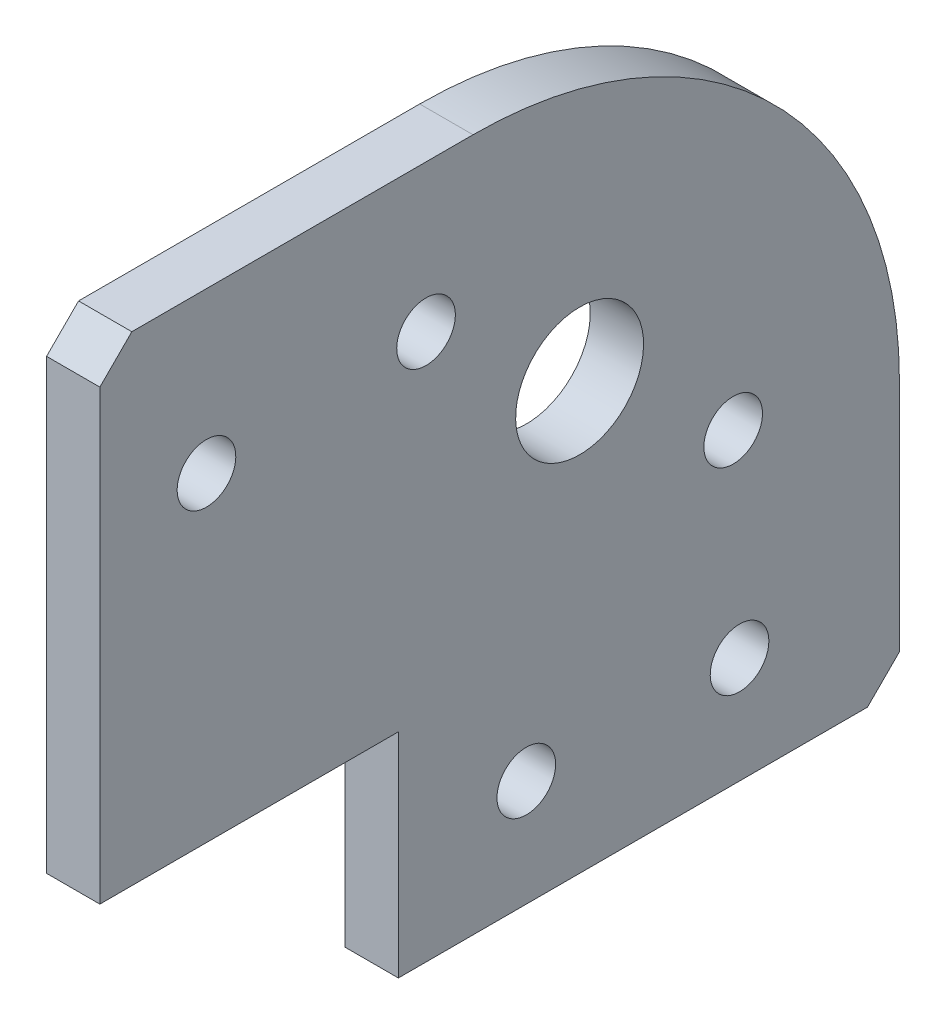
ISO-10303-21;
HEADER;
FILE_DESCRIPTION(('STEP AP214'),'2;1');
FILE_NAME('part.step','',(''),(''),'','','');
FILE_SCHEMA(('AUTOMOTIVE_DESIGN { 1 0 10303 214 1 1 1 1 }'));
ENDSEC;
DATA;
#1=APPLICATION_CONTEXT('core data for automotive mechanical design processes');
#2=APPLICATION_PROTOCOL_DEFINITION('international standard','automotive_design',2000,#1);
#3=PRODUCT_CONTEXT('',#1,'mechanical');
#4=PRODUCT('Part','Part','',(#3));
#5=PRODUCT_RELATED_PRODUCT_CATEGORY('part','',(#4));
#6=PRODUCT_DEFINITION_FORMATION('','',#4);
#7=PRODUCT_DEFINITION_CONTEXT('part definition',#1,'design');
#8=PRODUCT_DEFINITION('design','',#6,#7);
#9=PRODUCT_DEFINITION_SHAPE('','',#8);
#10=(LENGTH_UNIT() NAMED_UNIT(*) SI_UNIT(.MILLI.,.METRE.));
#11=(NAMED_UNIT(*) PLANE_ANGLE_UNIT() SI_UNIT($,.RADIAN.));
#12=(NAMED_UNIT(*) SI_UNIT($,.STERADIAN.) SOLID_ANGLE_UNIT());
#13=UNCERTAINTY_MEASURE_WITH_UNIT(LENGTH_MEASURE(1.E-05),#10,'distance_accuracy_value','');
#14=(GEOMETRIC_REPRESENTATION_CONTEXT(3) GLOBAL_UNCERTAINTY_ASSIGNED_CONTEXT((#13)) GLOBAL_UNIT_ASSIGNED_CONTEXT((#10,
#11,#12)) REPRESENTATION_CONTEXT('',''));
#15=CARTESIAN_POINT('',(0.,0.,0.));
#16=DIRECTION('',(0.,0.,1.));
#17=DIRECTION('',(1.,0.,0.));
#18=AXIS2_PLACEMENT_3D('',#15,#16,#17);
#19=CARTESIAN_POINT('',(605.828774838871,24.9999999999957,-39.9999999999997));
#20=DIRECTION('',(0.,0.,-1.));
#21=DIRECTION('',(0.,1.,0.));
#22=AXIS2_PLACEMENT_3D('',#19,#20,#21);
#23=PLANE('',#22);
#24=DIRECTION('',(0.,-1.,0.));
#25=VECTOR('',#24,1.);
#26=CARTESIAN_POINT('',(600.828774838871,24.9999999999957,-39.9999999999997));
#27=LINE('',#26,#25);
#28=CARTESIAN_POINT('',(600.828774838871,-15.0000000000043,-39.9999999999996));
#29=VERTEX_POINT('',#28);
#30=CARTESIAN_POINT('',(600.828774838871,-37.0000000000043,-39.9999999999996));
#31=VERTEX_POINT('',#30);
#32=EDGE_CURVE('E168',#29,#31,#27,.T.);
#33=ORIENTED_EDGE('',*,*,#32,.F.);
#34=DIRECTION('',(-1.,0.,0.));
#35=VECTOR('',#34,1.);
#36=CARTESIAN_POINT('',(605.828774838871,-15.0000000000044,-39.9999999999996));
#37=LINE('',#36,#35);
#38=CARTESIAN_POINT('',(605.828774838871,-15.0000000000044,-39.9999999999996));
#39=VERTEX_POINT('',#38);
#40=EDGE_CURVE('E43',#29,#39,#37,.F.);
#41=ORIENTED_EDGE('',*,*,#40,.T.);
#42=DIRECTION('',(0.,-1.,0.));
#43=VECTOR('',#42,1.);
#44=CARTESIAN_POINT('',(605.828774838871,24.9999999999957,-39.9999999999997));
#45=LINE('',#44,#43);
#46=CARTESIAN_POINT('',(605.828774838871,-37.0000000000043,-39.9999999999996));
#47=VERTEX_POINT('',#46);
#48=EDGE_CURVE('E171',#39,#47,#45,.T.);
#49=ORIENTED_EDGE('',*,*,#48,.T.);
#50=DIRECTION('',(-1.,0.,0.));
#51=VECTOR('',#50,1.);
#52=CARTESIAN_POINT('',(605.828774838871,-37.0000000000043,-39.9999999999996));
#53=LINE('',#52,#51);
#54=EDGE_CURVE('E182',#47,#31,#53,.T.);
#55=ORIENTED_EDGE('',*,*,#54,.T.);
#56=EDGE_LOOP('',(#33,#41,#49,#55));
#57=FACE_BOUND('',#56,.T.);
#58=ADVANCED_FACE('F35',(#57),#23,.T.);
#59=CARTESIAN_POINT('',(605.828774838871,24.9999999999957,35.0000000000004));
#60=DIRECTION('',(0.,1.,0.));
#61=DIRECTION('',(-1.,0.,0.));
#62=AXIS2_PLACEMENT_3D('',#59,#60,#61);
#63=PLANE('',#62);
#64=DIRECTION('',(0.,0.,-1.));
#65=VECTOR('',#64,1.);
#66=CARTESIAN_POINT('',(605.828774838871,24.9999999999957,35.0000000000004));
#67=LINE('',#66,#65);
#68=CARTESIAN_POINT('',(605.828774838871,24.9999999999957,32.0000000000003));
#69=VERTEX_POINT('',#68);
#70=CARTESIAN_POINT('',(605.828774838871,24.9999999999957,3.7470027081099E-13));
#71=VERTEX_POINT('',#70);
#72=EDGE_CURVE('E179',#69,#71,#67,.T.);
#73=ORIENTED_EDGE('',*,*,#72,.T.);
#74=DIRECTION('',(-1.,0.,0.));
#75=VECTOR('',#74,1.);
#76=CARTESIAN_POINT('',(605.828774838871,24.9999999999957,3.81639164714898E-13));
#77=LINE('',#76,#75);
#78=CARTESIAN_POINT('',(600.828774838871,24.9999999999957,3.7470027081099E-13));
#79=VERTEX_POINT('',#78);
#80=EDGE_CURVE('E207',#71,#79,#77,.T.);
#81=ORIENTED_EDGE('',*,*,#80,.T.);
#82=DIRECTION('',(0.,0.,-1.));
#83=VECTOR('',#82,1.);
#84=CARTESIAN_POINT('',(600.828774838871,24.9999999999957,35.0000000000004));
#85=LINE('',#84,#83);
#86=CARTESIAN_POINT('',(600.828774838871,24.9999999999957,32.0000000000003));
#87=VERTEX_POINT('',#86);
#88=EDGE_CURVE('E174',#87,#79,#85,.T.);
#89=ORIENTED_EDGE('',*,*,#88,.F.);
#90=DIRECTION('',(1.,0.,0.));
#91=VECTOR('',#90,1.);
#92=CARTESIAN_POINT('',(605.828774838871,24.9999999999957,32.0000000000003));
#93=LINE('',#92,#91);
#94=EDGE_CURVE('E205',#87,#69,#93,.T.);
#95=ORIENTED_EDGE('',*,*,#94,.T.);
#96=EDGE_LOOP('',(#73,#81,#89,#95));
#97=FACE_BOUND('',#96,.T.);
#98=ADVANCED_FACE('F213',(#97),#63,.T.);
#99=CARTESIAN_POINT('',(605.828774838871,-40.0000000000043,35.0000000000004));
#100=DIRECTION('',(0.,0.,1.));
#101=DIRECTION('',(1.,0.,0.));
#102=AXIS2_PLACEMENT_3D('',#99,#100,#101);
#103=PLANE('',#102);
#104=DIRECTION('',(-1.,0.,0.));
#105=VECTOR('',#104,1.);
#106=CARTESIAN_POINT('',(605.829774838871,-20.0000000000043,35.0000000000004));
#107=LINE('',#106,#105);
#108=CARTESIAN_POINT('',(605.828774838871,-20.0000000000043,35.0000000000004));
#109=VERTEX_POINT('',#108);
#110=CARTESIAN_POINT('',(600.828774838871,-20.0000000000043,35.0000000000004));
#111=VERTEX_POINT('',#110);
#112=EDGE_CURVE('E114',#109,#111,#107,.T.);
#113=ORIENTED_EDGE('',*,*,#112,.F.);
#114=DIRECTION('',(0.,1.,0.));
#115=VECTOR('',#114,1.);
#116=CARTESIAN_POINT('',(605.828774838871,-40.0000000000043,35.0000000000004));
#117=LINE('',#116,#115);
#118=CARTESIAN_POINT('',(605.828774838871,21.9999999999957,35.0000000000004));
#119=VERTEX_POINT('',#118);
#120=EDGE_CURVE('E177',#109,#119,#117,.T.);
#121=ORIENTED_EDGE('',*,*,#120,.T.);
#122=DIRECTION('',(-1.,0.,0.));
#123=VECTOR('',#122,1.);
#124=CARTESIAN_POINT('',(605.828774838871,21.9999999999957,35.0000000000004));
#125=LINE('',#124,#123);
#126=CARTESIAN_POINT('',(600.828774838871,21.9999999999957,35.0000000000004));
#127=VERTEX_POINT('',#126);
#128=EDGE_CURVE('E202',#119,#127,#125,.T.);
#129=ORIENTED_EDGE('',*,*,#128,.T.);
#130=DIRECTION('',(0.,1.,0.));
#131=VECTOR('',#130,1.);
#132=CARTESIAN_POINT('',(600.828774838871,-40.0000000000043,35.0000000000004));
#133=LINE('',#132,#131);
#134=EDGE_CURVE('E185',#111,#127,#133,.T.);
#135=ORIENTED_EDGE('',*,*,#134,.F.);
#136=EDGE_LOOP('',(#113,#121,#129,#135));
#137=FACE_BOUND('',#136,.T.);
#138=ADVANCED_FACE('F224',(#137),#103,.T.);
#139=CARTESIAN_POINT('',(605.828774838871,-40.0000000000043,-39.9999999999996));
#140=DIRECTION('',(0.,-1.,0.));
#141=DIRECTION('',(1.,0.,0.));
#142=AXIS2_PLACEMENT_3D('',#139,#140,#141);
#143=PLANE('',#142);
#144=DIRECTION('',(-1.,0.,0.));
#145=VECTOR('',#144,1.);
#146=CARTESIAN_POINT('',(605.829774838871,-40.0000000000043,7.00000000000037));
#147=LINE('',#146,#145);
#148=CARTESIAN_POINT('',(605.828774838871,-40.0000000000043,7.00000000000037));
#149=VERTEX_POINT('',#148);
#150=CARTESIAN_POINT('',(600.828774838871,-40.0000000000043,7.00000000000037));
#151=VERTEX_POINT('',#150);
#152=EDGE_CURVE('E113',#149,#151,#147,.T.);
#153=ORIENTED_EDGE('',*,*,#152,.T.);
#154=DIRECTION('',(0.,0.,1.));
#155=VECTOR('',#154,1.);
#156=CARTESIAN_POINT('',(600.828774838871,-40.0000000000043,-39.9999999999996));
#157=LINE('',#156,#155);
#158=CARTESIAN_POINT('',(600.828774838871,-40.0000000000043,-36.9999999999996));
#159=VERTEX_POINT('',#158);
#160=EDGE_CURVE('E126',#159,#151,#157,.T.);
#161=ORIENTED_EDGE('',*,*,#160,.F.);
#162=DIRECTION('',(1.,0.,0.));
#163=VECTOR('',#162,1.);
#164=CARTESIAN_POINT('',(605.828774838871,-40.0000000000043,-36.9999999999996));
#165=LINE('',#164,#163);
#166=CARTESIAN_POINT('',(605.828774838871,-40.0000000000043,-36.9999999999996));
#167=VERTEX_POINT('',#166);
#168=EDGE_CURVE('E194',#159,#167,#165,.T.);
#169=ORIENTED_EDGE('',*,*,#168,.T.);
#170=DIRECTION('',(0.,0.,1.));
#171=VECTOR('',#170,1.);
#172=CARTESIAN_POINT('',(605.828774838871,-40.0000000000043,-39.9999999999996));
#173=LINE('',#172,#171);
#174=EDGE_CURVE('E173',#167,#149,#173,.T.);
#175=ORIENTED_EDGE('',*,*,#174,.T.);
#176=EDGE_LOOP('',(#153,#161,#169,#175));
#177=FACE_BOUND('',#176,.T.);
#178=ADVANCED_FACE('F241',(#177),#143,.T.);
#179=CARTESIAN_POINT('',(605.828774838871,-4.14047445791686E-12,8.9329103349744E-13));
#180=DIRECTION('',(-1.,0.,0.));
#181=DIRECTION('',(0.,-1.,0.));
#182=AXIS2_PLACEMENT_3D('',#179,#180,#181);
#183=PLANE('',#182);
#184=CARTESIAN_POINT('',(605.828774838871,11.204416196643,4.40567796711833));
#185=DIRECTION('',(-1.,0.,0.));
#186=DIRECTION('',(0.,-1.,0.));
#187=AXIS2_PLACEMENT_3D('',#184,#185,#186);
#188=CIRCLE('',#187,2.74999999999882);
#189=CARTESIAN_POINT('',(605.828774838871,8.45441619664418,4.40567796711833));
#190=VERTEX_POINT('',#189);
#191=EDGE_CURVE('E138',#190,#190,#188,.F.);
#192=ORIENTED_EDGE('',*,*,#191,.F.);
#193=EDGE_LOOP('',(#192));
#194=FACE_BOUND('',#193,.T.);
#195=CARTESIAN_POINT('',(605.828774838871,-11.2044161966516,-24.4056779671176));
#196=DIRECTION('',(-1.,0.,0.));
#197=DIRECTION('',(0.,-1.,0.));
#198=AXIS2_PLACEMENT_3D('',#195,#196,#197);
#199=CIRCLE('',#198,2.74999999999882);
#200=CARTESIAN_POINT('',(605.828774838871,-13.9544161966504,-24.4056779671176));
#201=VERTEX_POINT('',#200);
#202=EDGE_CURVE('E139',#201,#201,#199,.F.);
#203=ORIENTED_EDGE('',*,*,#202,.F.);
#204=EDGE_LOOP('',(#203));
#205=FACE_BOUND('',#204,.T.);
#206=CARTESIAN_POINT('',(605.828774838871,-4.29963245912592E-12,-9.99999999999962));
#207=DIRECTION('',(-1.,0.,0.));
#208=DIRECTION('',(0.,1.,0.));
#209=AXIS2_PLACEMENT_3D('',#206,#207,#208);
#210=CIRCLE('',#209,6.);
#211=CARTESIAN_POINT('',(605.828774838871,5.9999999999957,-9.99999999999962));
#212=VERTEX_POINT('',#211);
#213=EDGE_CURVE('E147',#212,#212,#210,.T.);
#214=ORIENTED_EDGE('',*,*,#213,.T.);
#215=EDGE_LOOP('',(#214));
#216=FACE_BOUND('',#215,.T.);
#217=CARTESIAN_POINT('',(605.828774838871,-30.0000000000043,-24.9999999999996));
#218=DIRECTION('',(-1.,0.,0.));
#219=DIRECTION('',(0.,1.,0.));
#220=AXIS2_PLACEMENT_3D('',#217,#218,#219);
#221=CIRCLE('',#220,2.75000000000001);
#222=CARTESIAN_POINT('',(605.828774838871,-27.2500000000043,-24.9999999999996));
#223=VERTEX_POINT('',#222);
#224=EDGE_CURVE('E153',#223,#223,#221,.T.);
#225=ORIENTED_EDGE('',*,*,#224,.T.);
#226=EDGE_LOOP('',(#225));
#227=FACE_BOUND('',#226,.T.);
#228=CARTESIAN_POINT('',(605.828774838871,9.9999999999957,25.0000000000004));
#229=DIRECTION('',(-1.,0.,0.));
#230=DIRECTION('',(0.,1.,0.));
#231=AXIS2_PLACEMENT_3D('',#228,#229,#230);
#232=CIRCLE('',#231,2.75);
#233=CARTESIAN_POINT('',(605.828774838871,12.7499999999957,25.0000000000004));
#234=VERTEX_POINT('',#233);
#235=EDGE_CURVE('E159',#234,#234,#232,.T.);
#236=ORIENTED_EDGE('',*,*,#235,.T.);
#237=EDGE_LOOP('',(#236));
#238=FACE_BOUND('',#237,.T.);
#239=CARTESIAN_POINT('',(605.828774838871,-30.0000000000043,-4.99999999999962));
#240=DIRECTION('',(-1.,0.,0.));
#241=DIRECTION('',(0.,-1.,0.));
#242=AXIS2_PLACEMENT_3D('',#239,#240,#241);
#243=CIRCLE('',#242,2.75);
#244=CARTESIAN_POINT('',(605.828774838871,-32.7500000000043,-4.99999999999962));
#245=VERTEX_POINT('',#244);
#246=EDGE_CURVE('E165',#245,#245,#243,.T.);
#247=ORIENTED_EDGE('',*,*,#246,.T.);
#248=EDGE_LOOP('',(#247));
#249=FACE_BOUND('',#248,.T.);
#250=ORIENTED_EDGE('',*,*,#48,.F.);
#251=CARTESIAN_POINT('',(605.828774838871,-15.0000000000043,3.88578058618805E-13));
#252=DIRECTION('',(-1.,0.,0.));
#253=DIRECTION('',(0.,-1.,0.));
#254=AXIS2_PLACEMENT_3D('',#251,#252,#253);
#255=CIRCLE('',#254,40.);
#256=EDGE_CURVE('E11',#39,#71,#255,.F.);
#257=ORIENTED_EDGE('',*,*,#256,.T.);
#258=ORIENTED_EDGE('',*,*,#72,.F.);
#259=DIRECTION('',(0.,0.707106781186545,-0.70710678118655));
#260=VECTOR('',#259,1.);
#261=CARTESIAN_POINT('',(605.828774838871,21.9999999999957,35.0000000000004));
#262=LINE('',#261,#260);
#263=EDGE_CURVE('E196',#69,#119,#262,.F.);
#264=ORIENTED_EDGE('',*,*,#263,.T.);
#265=ORIENTED_EDGE('',*,*,#120,.F.);
#266=DIRECTION('',(0.,0.,1.));
#267=VECTOR('',#266,1.);
#268=CARTESIAN_POINT('',(605.828774838871,-20.0000000000043,35.0000000000004));
#269=LINE('',#268,#267);
#270=CARTESIAN_POINT('',(605.828774838871,-20.0000000000043,7.00000000000037));
#271=VERTEX_POINT('',#270);
#272=EDGE_CURVE('E131',#271,#109,#269,.T.);
#273=ORIENTED_EDGE('',*,*,#272,.F.);
#274=DIRECTION('',(0.,1.,0.));
#275=VECTOR('',#274,1.);
#276=CARTESIAN_POINT('',(605.828774838871,-20.0000000000043,7.00000000000037));
#277=LINE('',#276,#275);
#278=EDGE_CURVE('E110',#149,#271,#277,.T.);
#279=ORIENTED_EDGE('',*,*,#278,.F.);
#280=ORIENTED_EDGE('',*,*,#174,.F.);
#281=DIRECTION('',(0.,-0.707106781186543,0.707106781186552));
#282=VECTOR('',#281,1.);
#283=CARTESIAN_POINT('',(605.828774838871,-37.0000000000043,-39.9999999999996));
#284=LINE('',#283,#282);
#285=EDGE_CURVE('E199',#167,#47,#284,.F.);
#286=ORIENTED_EDGE('',*,*,#285,.T.);
#287=EDGE_LOOP('',(#250,#257,#258,#264,#265,#273,#279,#280,#286));
#288=FACE_BOUND('',#287,.T.);
#289=ADVANCED_FACE('F227',(#194,#205,#216,#227,#238,#249,#288),#183,.F.);
#290=CARTESIAN_POINT('',(600.828774838871,-4.10494732112885E-12,8.89405252911252E-13));
#291=DIRECTION('',(-1.,0.,0.));
#292=DIRECTION('',(0.,-1.,0.));
#293=AXIS2_PLACEMENT_3D('',#290,#291,#292);
#294=PLANE('',#293);
#295=ORIENTED_EDGE('',*,*,#88,.T.);
#296=CARTESIAN_POINT('',(600.828774838871,-15.0000000000043,3.84692278032617E-13));
#297=DIRECTION('',(-1.,0.,0.));
#298=DIRECTION('',(0.,-1.,0.));
#299=AXIS2_PLACEMENT_3D('',#296,#297,#298);
#300=CIRCLE('',#299,40.);
#301=EDGE_CURVE('E57',#79,#29,#300,.T.);
#302=ORIENTED_EDGE('',*,*,#301,.T.);
#303=ORIENTED_EDGE('',*,*,#32,.T.);
#304=DIRECTION('',(0.,0.707106781186543,-0.707106781186552));
#305=VECTOR('',#304,1.);
#306=CARTESIAN_POINT('',(600.828774838871,-38.5000000000046,-38.4999999999992));
#307=LINE('',#306,#305);
#308=EDGE_CURVE('E192',#31,#159,#307,.F.);
#309=ORIENTED_EDGE('',*,*,#308,.T.);
#310=ORIENTED_EDGE('',*,*,#160,.T.);
#311=DIRECTION('',(0.,-1.,0.));
#312=VECTOR('',#311,1.);
#313=CARTESIAN_POINT('',(600.828774838871,-20.0000000000043,7.00000000000037));
#314=LINE('',#313,#312);
#315=CARTESIAN_POINT('',(600.828774838871,-20.0000000000043,7.00000000000037));
#316=VERTEX_POINT('',#315);
#317=EDGE_CURVE('E107',#316,#151,#314,.T.);
#318=ORIENTED_EDGE('',*,*,#317,.F.);
#319=DIRECTION('',(0.,0.,-1.));
#320=VECTOR('',#319,1.);
#321=CARTESIAN_POINT('',(600.828774838871,-20.0000000000043,35.0000000000004));
#322=LINE('',#321,#320);
#323=EDGE_CURVE('E117',#111,#316,#322,.T.);
#324=ORIENTED_EDGE('',*,*,#323,.F.);
#325=ORIENTED_EDGE('',*,*,#134,.T.);
#326=DIRECTION('',(0.,-0.707106781186545,0.70710678118655));
#327=VECTOR('',#326,1.);
#328=CARTESIAN_POINT('',(600.828774838871,28.4999999999956,28.5000000000004));
#329=LINE('',#328,#327);
#330=EDGE_CURVE('E190',#127,#87,#329,.F.);
#331=ORIENTED_EDGE('',*,*,#330,.T.);
#332=EDGE_LOOP('',(#295,#302,#303,#309,#310,#318,#324,#325,#331));
#333=FACE_BOUND('',#332,.T.);
#334=CARTESIAN_POINT('',(600.828774838871,11.204416196643,4.40567796711833));
#335=DIRECTION('',(-1.,0.,0.));
#336=DIRECTION('',(0.,-1.,0.));
#337=AXIS2_PLACEMENT_3D('',#334,#335,#336);
#338=CIRCLE('',#337,2.74999999999882);
#339=CARTESIAN_POINT('',(600.828774838871,8.45441619664421,4.40567796711833));
#340=VERTEX_POINT('',#339);
#341=EDGE_CURVE('E135',#340,#340,#338,.T.);
#342=ORIENTED_EDGE('',*,*,#341,.F.);
#343=EDGE_LOOP('',(#342));
#344=FACE_BOUND('',#343,.T.);
#345=CARTESIAN_POINT('',(600.828774838871,-11.2044161966516,-24.4056779671176));
#346=DIRECTION('',(-1.,0.,0.));
#347=DIRECTION('',(0.,-1.,0.));
#348=AXIS2_PLACEMENT_3D('',#345,#346,#347);
#349=CIRCLE('',#348,2.74999999999882);
#350=CARTESIAN_POINT('',(600.828774838871,-13.9544161966504,-24.4056779671176));
#351=VERTEX_POINT('',#350);
#352=EDGE_CURVE('E134',#351,#351,#349,.T.);
#353=ORIENTED_EDGE('',*,*,#352,.F.);
#354=EDGE_LOOP('',(#353));
#355=FACE_BOUND('',#354,.T.);
#356=CARTESIAN_POINT('',(600.828774838871,-4.26410532233791E-12,-9.99999999999963));
#357=DIRECTION('',(-1.,0.,0.));
#358=DIRECTION('',(0.,1.,0.));
#359=AXIS2_PLACEMENT_3D('',#356,#357,#358);
#360=CIRCLE('',#359,6.);
#361=CARTESIAN_POINT('',(600.828774838871,5.99999999999574,-9.99999999999963));
#362=VERTEX_POINT('',#361);
#363=EDGE_CURVE('E142',#362,#362,#360,.T.);
#364=ORIENTED_EDGE('',*,*,#363,.F.);
#365=EDGE_LOOP('',(#364));
#366=FACE_BOUND('',#365,.T.);
#367=CARTESIAN_POINT('',(600.828774838871,-30.0000000000043,-24.9999999999996));
#368=DIRECTION('',(-1.,0.,0.));
#369=DIRECTION('',(0.,1.,0.));
#370=AXIS2_PLACEMENT_3D('',#367,#368,#369);
#371=CIRCLE('',#370,2.75000000000001);
#372=CARTESIAN_POINT('',(600.828774838871,-27.2500000000043,-24.9999999999996));
#373=VERTEX_POINT('',#372);
#374=EDGE_CURVE('E150',#373,#373,#371,.T.);
#375=ORIENTED_EDGE('',*,*,#374,.F.);
#376=EDGE_LOOP('',(#375));
#377=FACE_BOUND('',#376,.T.);
#378=CARTESIAN_POINT('',(600.828774838871,9.99999999999574,25.0000000000004));
#379=DIRECTION('',(-1.,0.,0.));
#380=DIRECTION('',(0.,1.,0.));
#381=AXIS2_PLACEMENT_3D('',#378,#379,#380);
#382=CIRCLE('',#381,2.75);
#383=CARTESIAN_POINT('',(600.828774838871,12.7499999999957,25.0000000000004));
#384=VERTEX_POINT('',#383);
#385=EDGE_CURVE('E156',#384,#384,#382,.T.);
#386=ORIENTED_EDGE('',*,*,#385,.F.);
#387=EDGE_LOOP('',(#386));
#388=FACE_BOUND('',#387,.T.);
#389=CARTESIAN_POINT('',(600.828774838871,-30.0000000000043,-4.99999999999963));
#390=DIRECTION('',(-1.,0.,0.));
#391=DIRECTION('',(0.,-1.,0.));
#392=AXIS2_PLACEMENT_3D('',#389,#390,#391);
#393=CIRCLE('',#392,2.75);
#394=CARTESIAN_POINT('',(600.828774838871,-32.7500000000043,-4.99999999999963));
#395=VERTEX_POINT('',#394);
#396=EDGE_CURVE('E162',#395,#395,#393,.T.);
#397=ORIENTED_EDGE('',*,*,#396,.F.);
#398=EDGE_LOOP('',(#397));
#399=FACE_BOUND('',#398,.T.);
#400=ADVANCED_FACE('F123',(#333,#344,#355,#366,#377,#388,#399),#294,.T.);
#401=CARTESIAN_POINT('',(605.828774838871,-30.0000000000043,-4.99999999999962));
#402=DIRECTION('',(-1.,0.,0.));
#403=DIRECTION('',(0.,-1.,0.));
#404=AXIS2_PLACEMENT_3D('',#401,#402,#403);
#405=CYLINDRICAL_SURFACE('',#404,2.75);
#406=ORIENTED_EDGE('',*,*,#246,.F.);
#407=EDGE_LOOP('',(#406));
#408=FACE_BOUND('',#407,.T.);
#409=ORIENTED_EDGE('',*,*,#396,.T.);
#410=EDGE_LOOP('',(#409));
#411=FACE_BOUND('',#410,.T.);
#412=ADVANCED_FACE('F272',(#408,#411),#405,.F.);
#413=CARTESIAN_POINT('',(605.828774838871,9.9999999999957,25.0000000000004));
#414=DIRECTION('',(-1.,0.,0.));
#415=DIRECTION('',(0.,-1.,0.));
#416=AXIS2_PLACEMENT_3D('',#413,#414,#415);
#417=CYLINDRICAL_SURFACE('',#416,2.75);
#418=ORIENTED_EDGE('',*,*,#235,.F.);
#419=EDGE_LOOP('',(#418));
#420=FACE_BOUND('',#419,.T.);
#421=ORIENTED_EDGE('',*,*,#385,.T.);
#422=EDGE_LOOP('',(#421));
#423=FACE_BOUND('',#422,.T.);
#424=ADVANCED_FACE('F268',(#420,#423),#417,.F.);
#425=CARTESIAN_POINT('',(605.828774838871,-30.0000000000043,-24.9999999999996));
#426=DIRECTION('',(-1.,0.,0.));
#427=DIRECTION('',(0.,-1.,0.));
#428=AXIS2_PLACEMENT_3D('',#425,#426,#427);
#429=CYLINDRICAL_SURFACE('',#428,2.75000000000001);
#430=ORIENTED_EDGE('',*,*,#224,.F.);
#431=EDGE_LOOP('',(#430));
#432=FACE_BOUND('',#431,.T.);
#433=ORIENTED_EDGE('',*,*,#374,.T.);
#434=EDGE_LOOP('',(#433));
#435=FACE_BOUND('',#434,.T.);
#436=ADVANCED_FACE('F264',(#432,#435),#429,.F.);
#437=CARTESIAN_POINT('',(605.828774838871,-4.29963245912592E-12,-9.99999999999962));
#438=DIRECTION('',(-1.,0.,0.));
#439=DIRECTION('',(0.,-1.,0.));
#440=AXIS2_PLACEMENT_3D('',#437,#438,#439);
#441=CYLINDRICAL_SURFACE('',#440,6.);
#442=ORIENTED_EDGE('',*,*,#213,.F.);
#443=EDGE_LOOP('',(#442));
#444=FACE_BOUND('',#443,.T.);
#445=ORIENTED_EDGE('',*,*,#363,.T.);
#446=EDGE_LOOP('',(#445));
#447=FACE_BOUND('',#446,.T.);
#448=ADVANCED_FACE('F245',(#444,#447),#441,.F.);
#449=CARTESIAN_POINT('',(605.828774838871,-37.0000000000043,-39.9999999999996));
#450=DIRECTION('',(0.,0.707106781186552,0.707106781186543));
#451=DIRECTION('',(-1.,0.,0.));
#452=AXIS2_PLACEMENT_3D('',#449,#450,#451);
#453=PLANE('',#452);
#454=ORIENTED_EDGE('',*,*,#285,.F.);
#455=ORIENTED_EDGE('',*,*,#168,.F.);
#456=ORIENTED_EDGE('',*,*,#308,.F.);
#457=ORIENTED_EDGE('',*,*,#54,.F.);
#458=EDGE_LOOP('',(#454,#455,#456,#457));
#459=FACE_BOUND('',#458,.T.);
#460=ADVANCED_FACE('F243',(#459),#453,.F.);
#461=CARTESIAN_POINT('',(605.828774838871,21.9999999999957,35.0000000000004));
#462=DIRECTION('',(0.,-0.70710678118655,-0.707106781186545));
#463=DIRECTION('',(-1.,0.,0.));
#464=AXIS2_PLACEMENT_3D('',#461,#462,#463);
#465=PLANE('',#464);
#466=ORIENTED_EDGE('',*,*,#263,.F.);
#467=ORIENTED_EDGE('',*,*,#94,.F.);
#468=ORIENTED_EDGE('',*,*,#330,.F.);
#469=ORIENTED_EDGE('',*,*,#128,.F.);
#470=EDGE_LOOP('',(#466,#467,#468,#469));
#471=FACE_BOUND('',#470,.T.);
#472=ADVANCED_FACE('F222',(#471),#465,.F.);
#473=CARTESIAN_POINT('',(605.829774838871,-11.2044161966516,-24.4056779671176));
#474=DIRECTION('',(-1.,0.,0.));
#475=DIRECTION('',(0.,-1.,0.));
#476=AXIS2_PLACEMENT_3D('',#473,#474,#475);
#477=CYLINDRICAL_SURFACE('',#476,2.74999999999882);
#478=ORIENTED_EDGE('',*,*,#352,.T.);
#479=EDGE_LOOP('',(#478));
#480=FACE_BOUND('',#479,.T.);
#481=ORIENTED_EDGE('',*,*,#202,.T.);
#482=EDGE_LOOP('',(#481));
#483=FACE_BOUND('',#482,.T.);
#484=ADVANCED_FACE('F248',(#480,#483),#477,.F.);
#485=CARTESIAN_POINT('',(605.829774838872,11.204416196643,4.40567796711833));
#486=DIRECTION('',(-1.,0.,0.));
#487=DIRECTION('',(0.,-1.,0.));
#488=AXIS2_PLACEMENT_3D('',#485,#486,#487);
#489=CYLINDRICAL_SURFACE('',#488,2.74999999999882);
#490=ORIENTED_EDGE('',*,*,#341,.T.);
#491=EDGE_LOOP('',(#490));
#492=FACE_BOUND('',#491,.T.);
#493=ORIENTED_EDGE('',*,*,#191,.T.);
#494=EDGE_LOOP('',(#493));
#495=FACE_BOUND('',#494,.T.);
#496=ADVANCED_FACE('F252',(#492,#495),#489,.F.);
#497=CARTESIAN_POINT('',(605.829774838871,-20.0000000000043,7.00000000000037));
#498=DIRECTION('',(0.,0.,-1.));
#499=DIRECTION('',(0.,1.,0.));
#500=AXIS2_PLACEMENT_3D('',#497,#498,#499);
#501=PLANE('',#500);
#502=ORIENTED_EDGE('',*,*,#278,.T.);
#503=DIRECTION('',(-1.,0.,0.));
#504=VECTOR('',#503,1.);
#505=CARTESIAN_POINT('',(605.829774838871,-20.0000000000043,7.00000000000037));
#506=LINE('',#505,#504);
#507=EDGE_CURVE('E103',#271,#316,#506,.T.);
#508=ORIENTED_EDGE('',*,*,#507,.T.);
#509=ORIENTED_EDGE('',*,*,#317,.T.);
#510=ORIENTED_EDGE('',*,*,#152,.F.);
#511=EDGE_LOOP('',(#502,#508,#509,#510));
#512=FACE_BOUND('',#511,.T.);
#513=ADVANCED_FACE('F105',(#512),#501,.F.);
#514=CARTESIAN_POINT('',(605.829774838871,-20.0000000000043,35.0000000000004));
#515=DIRECTION('',(0.,1.,0.));
#516=DIRECTION('',(-1.,0.,0.));
#517=AXIS2_PLACEMENT_3D('',#514,#515,#516);
#518=PLANE('',#517);
#519=ORIENTED_EDGE('',*,*,#272,.T.);
#520=ORIENTED_EDGE('',*,*,#112,.T.);
#521=ORIENTED_EDGE('',*,*,#323,.T.);
#522=ORIENTED_EDGE('',*,*,#507,.F.);
#523=EDGE_LOOP('',(#519,#520,#521,#522));
#524=FACE_BOUND('',#523,.T.);
#525=ADVANCED_FACE('F118',(#524),#518,.F.);
#526=CARTESIAN_POINT('',(605.828774838871,-15.0000000000043,3.88578058618805E-13));
#527=DIRECTION('',(-1.,0.,0.));
#528=DIRECTION('',(0.,-1.,0.));
#529=AXIS2_PLACEMENT_3D('',#526,#527,#528);
#530=CYLINDRICAL_SURFACE('',#529,40.);
#531=ORIENTED_EDGE('',*,*,#256,.F.);
#532=ORIENTED_EDGE('',*,*,#40,.F.);
#533=ORIENTED_EDGE('',*,*,#301,.F.);
#534=ORIENTED_EDGE('',*,*,#80,.F.);
#535=EDGE_LOOP('',(#531,#532,#533,#534));
#536=FACE_BOUND('',#535,.T.);
#537=ADVANCED_FACE('F37',(#536),#530,.T.);
#538=CLOSED_SHELL('',(#58,#98,#138,#178,#289,#400,#412,#424,#436,#448,#460,#472,#484,#496,#513,
#525,#537));
#539=MANIFOLD_SOLID_BREP('B2',#538);
#540=ADVANCED_BREP_SHAPE_REPRESENTATION('',(#18,#539),#14);
#541=SHAPE_DEFINITION_REPRESENTATION(#9,#540);
ENDSEC;
END-ISO-10303-21;
